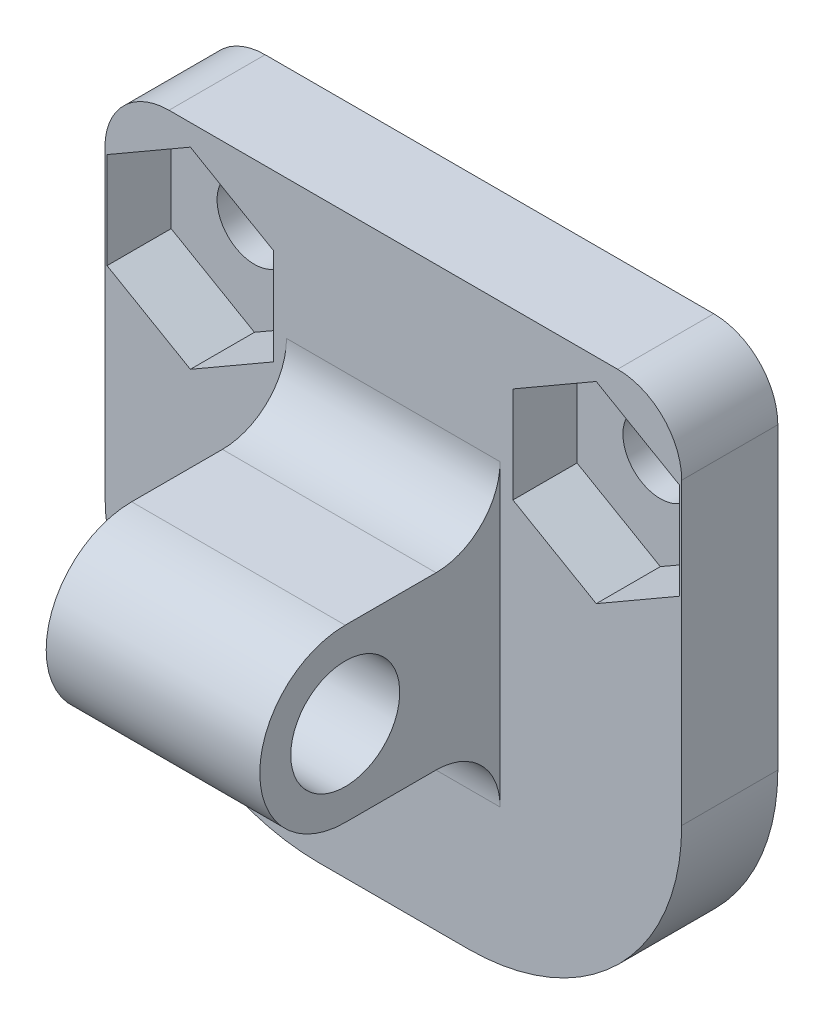
ISO-10303-21;
HEADER;
FILE_DESCRIPTION(('STEP AP214'),'2;1');
FILE_NAME('part.step','',(''),(''),'','','');
FILE_SCHEMA(('AUTOMOTIVE_DESIGN { 1 0 10303 214 1 1 1 1 }'));
ENDSEC;
DATA;
#1=APPLICATION_CONTEXT('core data for automotive mechanical design processes');
#2=APPLICATION_PROTOCOL_DEFINITION('international standard','automotive_design',2000,#1);
#3=PRODUCT_CONTEXT('',#1,'mechanical');
#4=PRODUCT('Part','Part','',(#3));
#5=PRODUCT_RELATED_PRODUCT_CATEGORY('part','',(#4));
#6=PRODUCT_DEFINITION_FORMATION('','',#4);
#7=PRODUCT_DEFINITION_CONTEXT('part definition',#1,'design');
#8=PRODUCT_DEFINITION('design','',#6,#7);
#9=PRODUCT_DEFINITION_SHAPE('','',#8);
#10=(LENGTH_UNIT() NAMED_UNIT(*) SI_UNIT(.MILLI.,.METRE.));
#11=(NAMED_UNIT(*) PLANE_ANGLE_UNIT() SI_UNIT($,.RADIAN.));
#12=(NAMED_UNIT(*) SI_UNIT($,.STERADIAN.) SOLID_ANGLE_UNIT());
#13=UNCERTAINTY_MEASURE_WITH_UNIT(LENGTH_MEASURE(1.E-05),#10,'distance_accuracy_value','');
#14=(GEOMETRIC_REPRESENTATION_CONTEXT(3) GLOBAL_UNCERTAINTY_ASSIGNED_CONTEXT((#13)) GLOBAL_UNIT_ASSIGNED_CONTEXT((#10,
#11,#12)) REPRESENTATION_CONTEXT('',''));
#15=CARTESIAN_POINT('',(0.,0.,0.));
#16=DIRECTION('',(0.,0.,1.));
#17=DIRECTION('',(1.,0.,0.));
#18=AXIS2_PLACEMENT_3D('',#15,#16,#17);
#19=CARTESIAN_POINT('',(-9.5,8.,4.5));
#20=DIRECTION('',(0.,0.,-1.));
#21=DIRECTION('',(-1.,0.,0.));
#22=AXIS2_PLACEMENT_3D('',#19,#20,#21);
#23=CYLINDRICAL_SURFACE('',#22,1.75);
#24=CARTESIAN_POINT('',(-9.5,8.,0.));
#25=DIRECTION('',(0.,0.,1.));
#26=DIRECTION('',(1.,0.,0.));
#27=AXIS2_PLACEMENT_3D('',#24,#25,#26);
#28=CIRCLE('',#27,1.75);
#29=CARTESIAN_POINT('',(-7.75,8.,0.));
#30=VERTEX_POINT('',#29);
#31=EDGE_CURVE('E426',#30,#30,#28,.T.);
#32=ORIENTED_EDGE('',*,*,#31,.F.);
#33=EDGE_LOOP('',(#32));
#34=FACE_BOUND('',#33,.T.);
#35=CARTESIAN_POINT('',(-9.5,8.,1.5));
#36=DIRECTION('',(0.,0.,1.));
#37=DIRECTION('',(1.,0.,0.));
#38=AXIS2_PLACEMENT_3D('',#35,#36,#37);
#39=CIRCLE('',#38,1.75);
#40=CARTESIAN_POINT('',(-7.75,8.,1.5));
#41=VERTEX_POINT('',#40);
#42=EDGE_CURVE('E369',#41,#41,#39,.T.);
#43=ORIENTED_EDGE('',*,*,#42,.T.);
#44=EDGE_LOOP('',(#43));
#45=FACE_BOUND('',#44,.T.);
#46=ADVANCED_FACE('F43',(#34,#45),#23,.F.);
#47=CARTESIAN_POINT('',(-5.,0.,11.75));
#48=DIRECTION('',(1.,0.,0.));
#49=DIRECTION('',(0.,0.,-1.));
#50=AXIS2_PLACEMENT_3D('',#47,#48,#49);
#51=CYLINDRICAL_SURFACE('',#50,4.);
#52=DIRECTION('',(1.,0.,0.));
#53=VECTOR('',#52,1.);
#54=CARTESIAN_POINT('',(0.,4.,11.75));
#55=LINE('',#54,#53);
#56=CARTESIAN_POINT('',(-5.,4.,11.75));
#57=VERTEX_POINT('',#56);
#58=CARTESIAN_POINT('',(5.,4.,11.75));
#59=VERTEX_POINT('',#58);
#60=EDGE_CURVE('E458',#57,#59,#55,.T.);
#61=ORIENTED_EDGE('',*,*,#60,.F.);
#62=CARTESIAN_POINT('',(-5.,0.,11.75));
#63=DIRECTION('',(-1.,0.,0.));
#64=DIRECTION('',(0.,0.,1.));
#65=AXIS2_PLACEMENT_3D('',#62,#63,#64);
#66=CIRCLE('',#65,4.);
#67=CARTESIAN_POINT('',(-5.,-4.,11.75));
#68=VERTEX_POINT('',#67);
#69=EDGE_CURVE('E466',#68,#57,#66,.T.);
#70=ORIENTED_EDGE('',*,*,#69,.F.);
#71=DIRECTION('',(-1.,0.,0.));
#72=VECTOR('',#71,1.);
#73=CARTESIAN_POINT('',(-5.,-4.,11.75));
#74=LINE('',#73,#72);
#75=CARTESIAN_POINT('',(5.,-4.,11.75));
#76=VERTEX_POINT('',#75);
#77=EDGE_CURVE('E462',#76,#68,#74,.T.);
#78=ORIENTED_EDGE('',*,*,#77,.F.);
#79=CARTESIAN_POINT('',(5.,0.,11.75));
#80=DIRECTION('',(-1.,0.,0.));
#81=DIRECTION('',(0.,0.,1.));
#82=AXIS2_PLACEMENT_3D('',#79,#80,#81);
#83=CIRCLE('',#82,4.);
#84=EDGE_CURVE('E469',#59,#76,#83,.F.);
#85=ORIENTED_EDGE('',*,*,#84,.F.);
#86=EDGE_LOOP('',(#61,#70,#78,#85));
#87=FACE_BOUND('',#86,.T.);
#88=ADVANCED_FACE('F562',(#87),#51,.T.);
#89=CARTESIAN_POINT('',(0.,0.,4.5));
#90=DIRECTION('',(0.,0.,1.));
#91=DIRECTION('',(1.,0.,0.));
#92=AXIS2_PLACEMENT_3D('',#89,#90,#91);
#93=PLANE('',#92);
#94=DIRECTION('',(-0.866025403784439,0.5,0.));
#95=VECTOR('',#94,1.);
#96=CARTESIAN_POINT('',(-5.59999999999999,10.2516660498396,4.5));
#97=LINE('',#96,#95);
#98=CARTESIAN_POINT('',(-5.59999999999999,10.2516660498396,4.5));
#99=VERTEX_POINT('',#98);
#100=CARTESIAN_POINT('',(-9.49999999999998,12.5033320996791,4.5));
#101=VERTEX_POINT('',#100);
#102=EDGE_CURVE('E228',#99,#101,#97,.T.);
#103=ORIENTED_EDGE('',*,*,#102,.F.);
#104=DIRECTION('',(0.,1.,0.));
#105=VECTOR('',#104,1.);
#106=CARTESIAN_POINT('',(-5.59999999999999,5.74833395016049,4.5));
#107=LINE('',#106,#105);
#108=CARTESIAN_POINT('',(-5.59999999999999,5.74833395016049,4.5));
#109=VERTEX_POINT('',#108);
#110=EDGE_CURVE('E249',#109,#99,#107,.T.);
#111=ORIENTED_EDGE('',*,*,#110,.F.);
#112=DIRECTION('',(0.866025403784439,0.5,0.));
#113=VECTOR('',#112,1.);
#114=CARTESIAN_POINT('',(-9.49999999999998,3.49666790032095,4.5));
#115=LINE('',#114,#113);
#116=CARTESIAN_POINT('',(-9.49999999999998,3.49666790032095,4.5));
#117=VERTEX_POINT('',#116);
#118=EDGE_CURVE('E253',#117,#109,#115,.T.);
#119=ORIENTED_EDGE('',*,*,#118,.F.);
#120=DIRECTION('',(0.866025403784439,-0.5,0.));
#121=VECTOR('',#120,1.);
#122=CARTESIAN_POINT('',(-13.4,5.74833395016049,4.5));
#123=LINE('',#122,#121);
#124=CARTESIAN_POINT('',(-13.4,5.74833395016049,4.5));
#125=VERTEX_POINT('',#124);
#126=EDGE_CURVE('E277',#125,#117,#123,.T.);
#127=ORIENTED_EDGE('',*,*,#126,.F.);
#128=DIRECTION('',(0.,-1.,0.));
#129=VECTOR('',#128,1.);
#130=CARTESIAN_POINT('',(-13.4,10.2516660498396,4.5));
#131=LINE('',#130,#129);
#132=CARTESIAN_POINT('',(-13.4,10.2516660498396,4.5));
#133=VERTEX_POINT('',#132);
#134=EDGE_CURVE('E273',#133,#125,#131,.T.);
#135=ORIENTED_EDGE('',*,*,#134,.F.);
#136=DIRECTION('',(-0.866025403784439,-0.5,0.));
#137=VECTOR('',#136,1.);
#138=CARTESIAN_POINT('',(-9.49999999999998,12.5033320996791,4.5));
#139=LINE('',#138,#137);
#140=EDGE_CURVE('E269',#101,#133,#139,.T.);
#141=ORIENTED_EDGE('',*,*,#140,.F.);
#142=EDGE_LOOP('',(#103,#111,#119,#127,#135,#141));
#143=FACE_BOUND('',#142,.T.);
#144=DIRECTION('',(0.,-1.,0.));
#145=VECTOR('',#144,1.);
#146=CARTESIAN_POINT('',(5.59999999999999,5.74833395016049,4.5));
#147=LINE('',#146,#145);
#148=CARTESIAN_POINT('',(5.59999999999999,10.2516660498396,4.5));
#149=VERTEX_POINT('',#148);
#150=CARTESIAN_POINT('',(5.59999999999999,5.74833395016049,4.5));
#151=VERTEX_POINT('',#150);
#152=EDGE_CURVE('E325',#149,#151,#147,.T.);
#153=ORIENTED_EDGE('',*,*,#152,.F.);
#154=DIRECTION('',(-0.866025403784439,-0.5,0.));
#155=VECTOR('',#154,1.);
#156=CARTESIAN_POINT('',(5.59999999999999,10.2516660498396,4.5));
#157=LINE('',#156,#155);
#158=CARTESIAN_POINT('',(9.49999999999998,12.5033320996791,4.5));
#159=VERTEX_POINT('',#158);
#160=EDGE_CURVE('E304',#159,#149,#157,.T.);
#161=ORIENTED_EDGE('',*,*,#160,.F.);
#162=DIRECTION('',(-0.866025403784439,0.5,0.));
#163=VECTOR('',#162,1.);
#164=CARTESIAN_POINT('',(9.49999999999998,12.5033320996791,4.5));
#165=LINE('',#164,#163);
#166=CARTESIAN_POINT('',(13.4,10.2516660498396,4.5));
#167=VERTEX_POINT('',#166);
#168=EDGE_CURVE('E340',#167,#159,#165,.T.);
#169=ORIENTED_EDGE('',*,*,#168,.F.);
#170=DIRECTION('',(0.,1.,0.));
#171=VECTOR('',#170,1.);
#172=CARTESIAN_POINT('',(13.4,10.2516660498396,4.5));
#173=LINE('',#172,#171);
#174=CARTESIAN_POINT('',(13.4,5.74833395016049,4.5));
#175=VERTEX_POINT('',#174);
#176=EDGE_CURVE('E336',#175,#167,#173,.T.);
#177=ORIENTED_EDGE('',*,*,#176,.F.);
#178=DIRECTION('',(0.866025403784439,0.5,0.));
#179=VECTOR('',#178,1.);
#180=CARTESIAN_POINT('',(13.4,5.74833395016049,4.5));
#181=LINE('',#180,#179);
#182=CARTESIAN_POINT('',(9.49999999999998,3.49666790032095,4.5));
#183=VERTEX_POINT('',#182);
#184=EDGE_CURVE('E332',#183,#175,#181,.T.);
#185=ORIENTED_EDGE('',*,*,#184,.F.);
#186=DIRECTION('',(0.866025403784439,-0.5,0.));
#187=VECTOR('',#186,1.);
#188=CARTESIAN_POINT('',(9.49999999999998,3.49666790032095,4.5));
#189=LINE('',#188,#187);
#190=EDGE_CURVE('E328',#151,#183,#189,.T.);
#191=ORIENTED_EDGE('',*,*,#190,.F.);
#192=EDGE_LOOP('',(#153,#161,#169,#177,#185,#191));
#193=FACE_BOUND('',#192,.T.);
#194=DIRECTION('',(0.,1.,0.));
#195=VECTOR('',#194,1.);
#196=CARTESIAN_POINT('',(13.5,0.,4.5));
#197=LINE('',#196,#195);
#198=CARTESIAN_POINT('',(13.5,-3.5,4.5));
#199=VERTEX_POINT('',#198);
#200=CARTESIAN_POINT('',(13.5,10.5,4.5));
#201=VERTEX_POINT('',#200);
#202=EDGE_CURVE('E400',#199,#201,#197,.T.);
#203=ORIENTED_EDGE('',*,*,#202,.T.);
#204=CARTESIAN_POINT('',(10.5,10.5,4.5));
#205=DIRECTION('',(0.,0.,1.));
#206=DIRECTION('',(1.,0.,0.));
#207=AXIS2_PLACEMENT_3D('',#204,#205,#206);
#208=CIRCLE('',#207,3.);
#209=CARTESIAN_POINT('',(10.5,13.5,4.5));
#210=VERTEX_POINT('',#209);
#211=EDGE_CURVE('E52',#201,#210,#208,.T.);
#212=ORIENTED_EDGE('',*,*,#211,.T.);
#213=DIRECTION('',(1.,0.,0.));
#214=VECTOR('',#213,1.);
#215=CARTESIAN_POINT('',(0.,13.5,4.5));
#216=LINE('',#215,#214);
#217=CARTESIAN_POINT('',(-10.5,13.5,4.5));
#218=VERTEX_POINT('',#217);
#219=EDGE_CURVE('E404',#218,#210,#216,.T.);
#220=ORIENTED_EDGE('',*,*,#219,.F.);
#221=CARTESIAN_POINT('',(-10.5,10.5,4.5));
#222=DIRECTION('',(0.,0.,1.));
#223=DIRECTION('',(1.,0.,0.));
#224=AXIS2_PLACEMENT_3D('',#221,#222,#223);
#225=CIRCLE('',#224,3.);
#226=CARTESIAN_POINT('',(-13.5,10.5,4.5));
#227=VERTEX_POINT('',#226);
#228=EDGE_CURVE('E59',#218,#227,#225,.T.);
#229=ORIENTED_EDGE('',*,*,#228,.T.);
#230=DIRECTION('',(0.,1.,0.));
#231=VECTOR('',#230,1.);
#232=CARTESIAN_POINT('',(-13.5,0.,4.5));
#233=LINE('',#232,#231);
#234=CARTESIAN_POINT('',(-13.5,-3.5,4.5));
#235=VERTEX_POINT('',#234);
#236=EDGE_CURVE('E408',#235,#227,#233,.T.);
#237=ORIENTED_EDGE('',*,*,#236,.F.);
#238=CARTESIAN_POINT('',(-3.5,-3.5,4.5));
#239=DIRECTION('',(0.,0.,1.));
#240=DIRECTION('',(1.,0.,0.));
#241=AXIS2_PLACEMENT_3D('',#238,#239,#240);
#242=CIRCLE('',#241,10.);
#243=CARTESIAN_POINT('',(-3.5,-13.5,4.5));
#244=VERTEX_POINT('',#243);
#245=EDGE_CURVE('E449',#235,#244,#242,.T.);
#246=ORIENTED_EDGE('',*,*,#245,.T.);
#247=DIRECTION('',(1.,0.,0.));
#248=VECTOR('',#247,1.);
#249=CARTESIAN_POINT('',(0.,-13.5,4.5));
#250=LINE('',#249,#248);
#251=CARTESIAN_POINT('',(3.5,-13.5,4.5));
#252=VERTEX_POINT('',#251);
#253=EDGE_CURVE('E396',#244,#252,#250,.T.);
#254=ORIENTED_EDGE('',*,*,#253,.T.);
#255=CARTESIAN_POINT('',(3.5,-3.5,4.5));
#256=DIRECTION('',(0.,0.,1.));
#257=DIRECTION('',(1.,0.,0.));
#258=AXIS2_PLACEMENT_3D('',#255,#256,#257);
#259=CIRCLE('',#258,10.);
#260=EDGE_CURVE('E452',#252,#199,#259,.T.);
#261=ORIENTED_EDGE('',*,*,#260,.T.);
#262=EDGE_LOOP('',(#203,#212,#220,#229,#237,#246,#254,#261));
#263=FACE_BOUND('',#262,.T.);
#264=DIRECTION('',(-1.,0.,0.));
#265=VECTOR('',#264,1.);
#266=CARTESIAN_POINT('',(0.,-7.,4.5));
#267=LINE('',#266,#265);
#268=CARTESIAN_POINT('',(5.,-7.,4.5));
#269=VERTEX_POINT('',#268);
#270=CARTESIAN_POINT('',(-5.,-7.,4.5));
#271=VERTEX_POINT('',#270);
#272=EDGE_CURVE('E476',#269,#271,#267,.T.);
#273=ORIENTED_EDGE('',*,*,#272,.T.);
#274=DIRECTION('',(0.,-1.,0.));
#275=VECTOR('',#274,1.);
#276=CARTESIAN_POINT('',(-5.,0.,4.5));
#277=LINE('',#276,#275);
#278=CARTESIAN_POINT('',(-5.,7.,4.5));
#279=VERTEX_POINT('',#278);
#280=EDGE_CURVE('E389',#279,#271,#277,.T.);
#281=ORIENTED_EDGE('',*,*,#280,.F.);
#282=DIRECTION('',(-1.,0.,0.));
#283=VECTOR('',#282,1.);
#284=CARTESIAN_POINT('',(5.,7.,4.5));
#285=LINE('',#284,#283);
#286=CARTESIAN_POINT('',(5.,7.,4.5));
#287=VERTEX_POINT('',#286);
#288=EDGE_CURVE('E472',#279,#287,#285,.F.);
#289=ORIENTED_EDGE('',*,*,#288,.T.);
#290=DIRECTION('',(0.,-1.,0.));
#291=VECTOR('',#290,1.);
#292=CARTESIAN_POINT('',(5.,0.,4.5));
#293=LINE('',#292,#291);
#294=EDGE_CURVE('E392',#287,#269,#293,.T.);
#295=ORIENTED_EDGE('',*,*,#294,.T.);
#296=EDGE_LOOP('',(#273,#281,#289,#295));
#297=FACE_BOUND('',#296,.T.);
#298=ADVANCED_FACE('F525',(#143,#193,#263,#297),#93,.T.);
#299=CARTESIAN_POINT('',(0.,-13.5,4.5));
#300=DIRECTION('',(0.,1.,0.));
#301=DIRECTION('',(0.,0.,1.));
#302=AXIS2_PLACEMENT_3D('',#299,#300,#301);
#303=PLANE('',#302);
#304=DIRECTION('',(1.,0.,0.));
#305=VECTOR('',#304,1.);
#306=CARTESIAN_POINT('',(0.,-13.5,0.));
#307=LINE('',#306,#305);
#308=CARTESIAN_POINT('',(-3.5,-13.5,0.));
#309=VERTEX_POINT('',#308);
#310=CARTESIAN_POINT('',(3.5,-13.5,0.));
#311=VERTEX_POINT('',#310);
#312=EDGE_CURVE('E395',#309,#311,#307,.T.);
#313=ORIENTED_EDGE('',*,*,#312,.T.);
#314=DIRECTION('',(0.,0.,-1.));
#315=VECTOR('',#314,1.);
#316=CARTESIAN_POINT('',(3.5,-13.5,4.5));
#317=LINE('',#316,#315);
#318=EDGE_CURVE('E446',#311,#252,#317,.F.);
#319=ORIENTED_EDGE('',*,*,#318,.T.);
#320=ORIENTED_EDGE('',*,*,#253,.F.);
#321=DIRECTION('',(0.,0.,-1.));
#322=VECTOR('',#321,1.);
#323=CARTESIAN_POINT('',(-3.5,-13.5,0.));
#324=LINE('',#323,#322);
#325=EDGE_CURVE('E442',#244,#309,#324,.T.);
#326=ORIENTED_EDGE('',*,*,#325,.T.);
#327=EDGE_LOOP('',(#313,#319,#320,#326));
#328=FACE_BOUND('',#327,.T.);
#329=ADVANCED_FACE('F545',(#328),#303,.F.);
#330=CARTESIAN_POINT('',(13.5,0.,4.5));
#331=DIRECTION('',(-1.,0.,0.));
#332=DIRECTION('',(0.,0.,1.));
#333=AXIS2_PLACEMENT_3D('',#330,#331,#332);
#334=PLANE('',#333);
#335=DIRECTION('',(0.,1.,0.));
#336=VECTOR('',#335,1.);
#337=CARTESIAN_POINT('',(13.5,0.,0.));
#338=LINE('',#337,#336);
#339=CARTESIAN_POINT('',(13.5,-3.5,0.));
#340=VERTEX_POINT('',#339);
#341=CARTESIAN_POINT('',(13.5,10.5,0.));
#342=VERTEX_POINT('',#341);
#343=EDGE_CURVE('E415',#340,#342,#338,.T.);
#344=ORIENTED_EDGE('',*,*,#343,.T.);
#345=DIRECTION('',(0.,0.,-1.));
#346=VECTOR('',#345,1.);
#347=CARTESIAN_POINT('',(13.5,10.5,4.5));
#348=LINE('',#347,#346);
#349=EDGE_CURVE('E67',#342,#201,#348,.F.);
#350=ORIENTED_EDGE('',*,*,#349,.T.);
#351=ORIENTED_EDGE('',*,*,#202,.F.);
#352=DIRECTION('',(0.,0.,-1.));
#353=VECTOR('',#352,1.);
#354=CARTESIAN_POINT('',(13.5,-3.5,4.5));
#355=LINE('',#354,#353);
#356=EDGE_CURVE('E411',#199,#340,#355,.T.);
#357=ORIENTED_EDGE('',*,*,#356,.T.);
#358=EDGE_LOOP('',(#344,#350,#351,#357));
#359=FACE_BOUND('',#358,.T.);
#360=ADVANCED_FACE('F537',(#359),#334,.F.);
#361=CARTESIAN_POINT('',(0.,13.5,4.5));
#362=DIRECTION('',(0.,1.,0.));
#363=DIRECTION('',(0.,0.,1.));
#364=AXIS2_PLACEMENT_3D('',#361,#362,#363);
#365=PLANE('',#364);
#366=ORIENTED_EDGE('',*,*,#219,.T.);
#367=DIRECTION('',(0.,0.,-1.));
#368=VECTOR('',#367,1.);
#369=CARTESIAN_POINT('',(10.5,13.5,0.));
#370=LINE('',#369,#368);
#371=CARTESIAN_POINT('',(10.5,13.5,0.));
#372=VERTEX_POINT('',#371);
#373=EDGE_CURVE('E510',#210,#372,#370,.T.);
#374=ORIENTED_EDGE('',*,*,#373,.T.);
#375=DIRECTION('',(1.,0.,0.));
#376=VECTOR('',#375,1.);
#377=CARTESIAN_POINT('',(0.,13.5,0.));
#378=LINE('',#377,#376);
#379=CARTESIAN_POINT('',(-10.5,13.5,0.));
#380=VERTEX_POINT('',#379);
#381=EDGE_CURVE('E418',#380,#372,#378,.T.);
#382=ORIENTED_EDGE('',*,*,#381,.F.);
#383=DIRECTION('',(0.,0.,-1.));
#384=VECTOR('',#383,1.);
#385=CARTESIAN_POINT('',(-10.5,13.5,4.5));
#386=LINE('',#385,#384);
#387=EDGE_CURVE('E501',#380,#218,#386,.F.);
#388=ORIENTED_EDGE('',*,*,#387,.T.);
#389=EDGE_LOOP('',(#366,#374,#382,#388));
#390=FACE_BOUND('',#389,.T.);
#391=ADVANCED_FACE('F530',(#390),#365,.T.);
#392=CARTESIAN_POINT('',(-13.5,0.,4.5));
#393=DIRECTION('',(-1.,0.,0.));
#394=DIRECTION('',(0.,0.,1.));
#395=AXIS2_PLACEMENT_3D('',#392,#393,#394);
#396=PLANE('',#395);
#397=ORIENTED_EDGE('',*,*,#236,.T.);
#398=DIRECTION('',(0.,0.,-1.));
#399=VECTOR('',#398,1.);
#400=CARTESIAN_POINT('',(-13.5,10.5,4.5));
#401=LINE('',#400,#399);
#402=CARTESIAN_POINT('',(-13.5,10.5,0.));
#403=VERTEX_POINT('',#402);
#404=EDGE_CURVE('E11',#227,#403,#401,.T.);
#405=ORIENTED_EDGE('',*,*,#404,.T.);
#406=DIRECTION('',(0.,1.,0.));
#407=VECTOR('',#406,1.);
#408=CARTESIAN_POINT('',(-13.5,0.,0.));
#409=LINE('',#408,#407);
#410=CARTESIAN_POINT('',(-13.5,-3.5,0.));
#411=VERTEX_POINT('',#410);
#412=EDGE_CURVE('E422',#411,#403,#409,.T.);
#413=ORIENTED_EDGE('',*,*,#412,.F.);
#414=DIRECTION('',(0.,0.,-1.));
#415=VECTOR('',#414,1.);
#416=CARTESIAN_POINT('',(-13.5,-3.5,4.5));
#417=LINE('',#416,#415);
#418=EDGE_CURVE('E455',#411,#235,#417,.F.);
#419=ORIENTED_EDGE('',*,*,#418,.T.);
#420=EDGE_LOOP('',(#397,#405,#413,#419));
#421=FACE_BOUND('',#420,.T.);
#422=ADVANCED_FACE('F554',(#421),#396,.T.);
#423=CARTESIAN_POINT('',(9.5,8.,4.5));
#424=DIRECTION('',(0.,0.,-1.));
#425=DIRECTION('',(-1.,0.,0.));
#426=AXIS2_PLACEMENT_3D('',#423,#424,#425);
#427=CYLINDRICAL_SURFACE('',#426,1.75);
#428=CARTESIAN_POINT('',(9.5,8.,1.5));
#429=DIRECTION('',(0.,0.,-1.));
#430=DIRECTION('',(-1.,0.,0.));
#431=AXIS2_PLACEMENT_3D('',#428,#429,#430);
#432=CIRCLE('',#431,1.75);
#433=CARTESIAN_POINT('',(7.75,8.,1.5));
#434=VERTEX_POINT('',#433);
#435=EDGE_CURVE('E287',#434,#434,#432,.F.);
#436=ORIENTED_EDGE('',*,*,#435,.T.);
#437=EDGE_LOOP('',(#436));
#438=FACE_BOUND('',#437,.T.);
#439=CARTESIAN_POINT('',(9.5,8.,0.));
#440=DIRECTION('',(0.,0.,1.));
#441=DIRECTION('',(1.,0.,0.));
#442=AXIS2_PLACEMENT_3D('',#439,#440,#441);
#443=CIRCLE('',#442,1.75);
#444=CARTESIAN_POINT('',(11.25,8.,0.));
#445=VERTEX_POINT('',#444);
#446=EDGE_CURVE('E401',#445,#445,#443,.F.);
#447=ORIENTED_EDGE('',*,*,#446,.T.);
#448=EDGE_LOOP('',(#447));
#449=FACE_BOUND('',#448,.T.);
#450=ADVANCED_FACE('F574',(#438,#449),#427,.F.);
#451=CARTESIAN_POINT('',(0.,0.,0.));
#452=DIRECTION('',(0.,0.,1.));
#453=DIRECTION('',(1.,0.,0.));
#454=AXIS2_PLACEMENT_3D('',#451,#452,#453);
#455=PLANE('',#454);
#456=ORIENTED_EDGE('',*,*,#446,.F.);
#457=EDGE_LOOP('',(#456));
#458=FACE_BOUND('',#457,.T.);
#459=ORIENTED_EDGE('',*,*,#31,.T.);
#460=EDGE_LOOP('',(#459));
#461=FACE_BOUND('',#460,.T.);
#462=ORIENTED_EDGE('',*,*,#381,.T.);
#463=CARTESIAN_POINT('',(10.5,10.5,0.));
#464=DIRECTION('',(0.,0.,1.));
#465=DIRECTION('',(1.,0.,0.));
#466=AXIS2_PLACEMENT_3D('',#463,#464,#465);
#467=CIRCLE('',#466,3.);
#468=EDGE_CURVE('E517',#372,#342,#467,.F.);
#469=ORIENTED_EDGE('',*,*,#468,.T.);
#470=ORIENTED_EDGE('',*,*,#343,.F.);
#471=CARTESIAN_POINT('',(3.5,-3.5,0.));
#472=DIRECTION('',(0.,0.,1.));
#473=DIRECTION('',(1.,0.,0.));
#474=AXIS2_PLACEMENT_3D('',#471,#472,#473);
#475=CIRCLE('',#474,10.);
#476=EDGE_CURVE('E439',#340,#311,#475,.F.);
#477=ORIENTED_EDGE('',*,*,#476,.T.);
#478=ORIENTED_EDGE('',*,*,#312,.F.);
#479=CARTESIAN_POINT('',(-3.5,-3.5,0.));
#480=DIRECTION('',(0.,0.,1.));
#481=DIRECTION('',(1.,0.,0.));
#482=AXIS2_PLACEMENT_3D('',#479,#480,#481);
#483=CIRCLE('',#482,10.);
#484=EDGE_CURVE('E436',#309,#411,#483,.F.);
#485=ORIENTED_EDGE('',*,*,#484,.T.);
#486=ORIENTED_EDGE('',*,*,#412,.T.);
#487=CARTESIAN_POINT('',(-10.5,10.5,0.));
#488=DIRECTION('',(0.,0.,1.));
#489=DIRECTION('',(1.,0.,0.));
#490=AXIS2_PLACEMENT_3D('',#487,#488,#489);
#491=CIRCLE('',#490,3.);
#492=EDGE_CURVE('E514',#403,#380,#491,.F.);
#493=ORIENTED_EDGE('',*,*,#492,.T.);
#494=EDGE_LOOP('',(#462,#469,#470,#477,#478,#485,#486,#493));
#495=FACE_BOUND('',#494,.T.);
#496=ADVANCED_FACE('F536',(#458,#461,#495),#455,.F.);
#497=CARTESIAN_POINT('',(0.,-4.,15.75));
#498=DIRECTION('',(0.,1.,0.));
#499=DIRECTION('',(0.,0.,1.));
#500=AXIS2_PLACEMENT_3D('',#497,#498,#499);
#501=PLANE('',#500);
#502=DIRECTION('',(0.,0.,-1.));
#503=VECTOR('',#502,1.);
#504=CARTESIAN_POINT('',(-5.,-4.,15.75));
#505=LINE('',#504,#503);
#506=CARTESIAN_POINT('',(-5.,-4.,7.5));
#507=VERTEX_POINT('',#506);
#508=EDGE_CURVE('E373',#68,#507,#505,.T.);
#509=ORIENTED_EDGE('',*,*,#508,.T.);
#510=DIRECTION('',(-1.,0.,0.));
#511=VECTOR('',#510,1.);
#512=CARTESIAN_POINT('',(0.,-4.,7.5));
#513=LINE('',#512,#511);
#514=CARTESIAN_POINT('',(5.,-4.,7.5));
#515=VERTEX_POINT('',#514);
#516=EDGE_CURVE('E480',#507,#515,#513,.F.);
#517=ORIENTED_EDGE('',*,*,#516,.T.);
#518=DIRECTION('',(0.,0.,-1.));
#519=VECTOR('',#518,1.);
#520=CARTESIAN_POINT('',(5.,-4.,15.75));
#521=LINE('',#520,#519);
#522=EDGE_CURVE('E385',#76,#515,#521,.T.);
#523=ORIENTED_EDGE('',*,*,#522,.F.);
#524=ORIENTED_EDGE('',*,*,#77,.T.);
#525=EDGE_LOOP('',(#509,#517,#523,#524));
#526=FACE_BOUND('',#525,.T.);
#527=ADVANCED_FACE('F626',(#526),#501,.F.);
#528=CARTESIAN_POINT('',(5.,0.,15.75));
#529=DIRECTION('',(-1.,0.,0.));
#530=DIRECTION('',(0.,0.,1.));
#531=AXIS2_PLACEMENT_3D('',#528,#529,#530);
#532=PLANE('',#531);
#533=CARTESIAN_POINT('',(5.,0.,11.75));
#534=DIRECTION('',(-1.,0.,0.));
#535=DIRECTION('',(0.,0.,1.));
#536=AXIS2_PLACEMENT_3D('',#533,#534,#535);
#537=CIRCLE('',#536,2.55);
#538=CARTESIAN_POINT('',(5.,0.,14.3));
#539=VERTEX_POINT('',#538);
#540=EDGE_CURVE('E368',#539,#539,#537,.T.);
#541=ORIENTED_EDGE('',*,*,#540,.T.);
#542=EDGE_LOOP('',(#541));
#543=FACE_BOUND('',#542,.T.);
#544=DIRECTION('',(0.,0.,-1.));
#545=VECTOR('',#544,1.);
#546=CARTESIAN_POINT('',(5.,4.,15.75));
#547=LINE('',#546,#545);
#548=CARTESIAN_POINT('',(5.,4.,7.5));
#549=VERTEX_POINT('',#548);
#550=EDGE_CURVE('E381',#59,#549,#547,.T.);
#551=ORIENTED_EDGE('',*,*,#550,.F.);
#552=ORIENTED_EDGE('',*,*,#84,.T.);
#553=ORIENTED_EDGE('',*,*,#522,.T.);
#554=CARTESIAN_POINT('',(5.,-7.,7.5));
#555=DIRECTION('',(-1.,0.,0.));
#556=DIRECTION('',(0.,0.,1.));
#557=AXIS2_PLACEMENT_3D('',#554,#555,#556);
#558=CIRCLE('',#557,3.);
#559=EDGE_CURVE('E490',#515,#269,#558,.T.);
#560=ORIENTED_EDGE('',*,*,#559,.T.);
#561=ORIENTED_EDGE('',*,*,#294,.F.);
#562=CARTESIAN_POINT('',(5.,7.,7.5));
#563=DIRECTION('',(-1.,0.,0.));
#564=DIRECTION('',(0.,0.,1.));
#565=AXIS2_PLACEMENT_3D('',#562,#563,#564);
#566=CIRCLE('',#565,3.);
#567=EDGE_CURVE('E498',#287,#549,#566,.T.);
#568=ORIENTED_EDGE('',*,*,#567,.T.);
#569=EDGE_LOOP('',(#551,#552,#553,#560,#561,#568));
#570=FACE_BOUND('',#569,.T.);
#571=ADVANCED_FACE('F612',(#543,#570),#532,.F.);
#572=CARTESIAN_POINT('',(0.,4.,15.75));
#573=DIRECTION('',(0.,1.,0.));
#574=DIRECTION('',(0.,0.,1.));
#575=AXIS2_PLACEMENT_3D('',#572,#573,#574);
#576=PLANE('',#575);
#577=ORIENTED_EDGE('',*,*,#550,.T.);
#578=DIRECTION('',(-1.,0.,0.));
#579=VECTOR('',#578,1.);
#580=CARTESIAN_POINT('',(-5.,4.,7.5));
#581=LINE('',#580,#579);
#582=CARTESIAN_POINT('',(-5.,4.,7.5));
#583=VERTEX_POINT('',#582);
#584=EDGE_CURVE('E483',#549,#583,#581,.T.);
#585=ORIENTED_EDGE('',*,*,#584,.T.);
#586=DIRECTION('',(0.,0.,-1.));
#587=VECTOR('',#586,1.);
#588=CARTESIAN_POINT('',(-5.,4.,15.75));
#589=LINE('',#588,#587);
#590=EDGE_CURVE('E377',#57,#583,#589,.T.);
#591=ORIENTED_EDGE('',*,*,#590,.F.);
#592=ORIENTED_EDGE('',*,*,#60,.T.);
#593=EDGE_LOOP('',(#577,#585,#591,#592));
#594=FACE_BOUND('',#593,.T.);
#595=ADVANCED_FACE('F614',(#594),#576,.T.);
#596=CARTESIAN_POINT('',(-5.,0.,15.75));
#597=DIRECTION('',(-1.,0.,0.));
#598=DIRECTION('',(0.,0.,1.));
#599=AXIS2_PLACEMENT_3D('',#596,#597,#598);
#600=PLANE('',#599);
#601=CARTESIAN_POINT('',(-5.,0.,11.75));
#602=DIRECTION('',(-1.,0.,0.));
#603=DIRECTION('',(0.,0.,1.));
#604=AXIS2_PLACEMENT_3D('',#601,#602,#603);
#605=CIRCLE('',#604,2.55);
#606=CARTESIAN_POINT('',(-5.,0.,14.3));
#607=VERTEX_POINT('',#606);
#608=EDGE_CURVE('E364',#607,#607,#605,.T.);
#609=ORIENTED_EDGE('',*,*,#608,.F.);
#610=EDGE_LOOP('',(#609));
#611=FACE_BOUND('',#610,.T.);
#612=ORIENTED_EDGE('',*,*,#508,.F.);
#613=ORIENTED_EDGE('',*,*,#69,.T.);
#614=ORIENTED_EDGE('',*,*,#590,.T.);
#615=CARTESIAN_POINT('',(-5.,7.,7.5));
#616=DIRECTION('',(-1.,0.,0.));
#617=DIRECTION('',(0.,0.,1.));
#618=AXIS2_PLACEMENT_3D('',#615,#616,#617);
#619=CIRCLE('',#618,3.);
#620=EDGE_CURVE('E494',#583,#279,#619,.F.);
#621=ORIENTED_EDGE('',*,*,#620,.T.);
#622=ORIENTED_EDGE('',*,*,#280,.T.);
#623=CARTESIAN_POINT('',(-5.,-7.,7.5));
#624=DIRECTION('',(-1.,0.,0.));
#625=DIRECTION('',(0.,0.,1.));
#626=AXIS2_PLACEMENT_3D('',#623,#624,#625);
#627=CIRCLE('',#626,3.);
#628=EDGE_CURVE('E487',#271,#507,#627,.F.);
#629=ORIENTED_EDGE('',*,*,#628,.T.);
#630=EDGE_LOOP('',(#612,#613,#614,#621,#622,#629));
#631=FACE_BOUND('',#630,.T.);
#632=ADVANCED_FACE('F586',(#611,#631),#600,.T.);
#633=CARTESIAN_POINT('',(3.5,-3.5,4.5));
#634=DIRECTION('',(0.,0.,-1.));
#635=DIRECTION('',(-1.,0.,0.));
#636=AXIS2_PLACEMENT_3D('',#633,#634,#635);
#637=CYLINDRICAL_SURFACE('',#636,10.);
#638=ORIENTED_EDGE('',*,*,#260,.F.);
#639=ORIENTED_EDGE('',*,*,#318,.F.);
#640=ORIENTED_EDGE('',*,*,#476,.F.);
#641=ORIENTED_EDGE('',*,*,#356,.F.);
#642=EDGE_LOOP('',(#638,#639,#640,#641));
#643=FACE_BOUND('',#642,.T.);
#644=ADVANCED_FACE('F541',(#643),#637,.T.);
#645=CARTESIAN_POINT('',(-3.5,-3.5,4.5));
#646=DIRECTION('',(0.,0.,1.));
#647=DIRECTION('',(1.,0.,0.));
#648=AXIS2_PLACEMENT_3D('',#645,#646,#647);
#649=CYLINDRICAL_SURFACE('',#648,10.);
#650=ORIENTED_EDGE('',*,*,#245,.F.);
#651=ORIENTED_EDGE('',*,*,#418,.F.);
#652=ORIENTED_EDGE('',*,*,#484,.F.);
#653=ORIENTED_EDGE('',*,*,#325,.F.);
#654=EDGE_LOOP('',(#650,#651,#652,#653));
#655=FACE_BOUND('',#654,.T.);
#656=ADVANCED_FACE('F550',(#655),#649,.T.);
#657=CARTESIAN_POINT('',(13.5,0.,11.75));
#658=DIRECTION('',(-1.,0.,0.));
#659=DIRECTION('',(0.,0.,1.));
#660=AXIS2_PLACEMENT_3D('',#657,#658,#659);
#661=CYLINDRICAL_SURFACE('',#660,2.55);
#662=ORIENTED_EDGE('',*,*,#608,.T.);
#663=EDGE_LOOP('',(#662));
#664=FACE_BOUND('',#663,.T.);
#665=ORIENTED_EDGE('',*,*,#540,.F.);
#666=EDGE_LOOP('',(#665));
#667=FACE_BOUND('',#666,.T.);
#668=ADVANCED_FACE('F588',(#664,#667),#661,.F.);
#669=CARTESIAN_POINT('',(0.,-7.,7.5));
#670=DIRECTION('',(-1.,0.,0.));
#671=DIRECTION('',(0.,0.,1.));
#672=AXIS2_PLACEMENT_3D('',#669,#670,#671);
#673=CYLINDRICAL_SURFACE('',#672,3.);
#674=ORIENTED_EDGE('',*,*,#559,.F.);
#675=ORIENTED_EDGE('',*,*,#516,.F.);
#676=ORIENTED_EDGE('',*,*,#628,.F.);
#677=ORIENTED_EDGE('',*,*,#272,.F.);
#678=EDGE_LOOP('',(#674,#675,#676,#677));
#679=FACE_BOUND('',#678,.T.);
#680=ADVANCED_FACE('F593',(#679),#673,.F.);
#681=CARTESIAN_POINT('',(0.,7.,7.5));
#682=DIRECTION('',(1.,0.,0.));
#683=DIRECTION('',(0.,0.,-1.));
#684=AXIS2_PLACEMENT_3D('',#681,#682,#683);
#685=CYLINDRICAL_SURFACE('',#684,3.);
#686=ORIENTED_EDGE('',*,*,#567,.F.);
#687=ORIENTED_EDGE('',*,*,#288,.F.);
#688=ORIENTED_EDGE('',*,*,#620,.F.);
#689=ORIENTED_EDGE('',*,*,#584,.F.);
#690=EDGE_LOOP('',(#686,#687,#688,#689));
#691=FACE_BOUND('',#690,.T.);
#692=ADVANCED_FACE('F596',(#691),#685,.F.);
#693=CARTESIAN_POINT('',(0.,0.,1.5));
#694=DIRECTION('',(0.,0.,-1.));
#695=DIRECTION('',(-1.,0.,0.));
#696=AXIS2_PLACEMENT_3D('',#693,#694,#695);
#697=PLANE('',#696);
#698=DIRECTION('',(0.,-1.,0.));
#699=VECTOR('',#698,1.);
#700=CARTESIAN_POINT('',(5.59999999999999,5.74833395016049,1.5));
#701=LINE('',#700,#699);
#702=CARTESIAN_POINT('',(5.59999999999999,10.2516660498396,1.5));
#703=VERTEX_POINT('',#702);
#704=CARTESIAN_POINT('',(5.59999999999999,5.74833395016049,1.5));
#705=VERTEX_POINT('',#704);
#706=EDGE_CURVE('E299',#703,#705,#701,.T.);
#707=ORIENTED_EDGE('',*,*,#706,.T.);
#708=DIRECTION('',(0.866025403784439,-0.5,0.));
#709=VECTOR('',#708,1.);
#710=CARTESIAN_POINT('',(9.49999999999998,3.49666790032095,1.5));
#711=LINE('',#710,#709);
#712=CARTESIAN_POINT('',(9.49999999999998,3.49666790032095,1.5));
#713=VERTEX_POINT('',#712);
#714=EDGE_CURVE('E303',#705,#713,#711,.T.);
#715=ORIENTED_EDGE('',*,*,#714,.T.);
#716=DIRECTION('',(0.866025403784439,0.5,0.));
#717=VECTOR('',#716,1.);
#718=CARTESIAN_POINT('',(13.4,5.74833395016049,1.5));
#719=LINE('',#718,#717);
#720=CARTESIAN_POINT('',(13.4,5.74833395016049,1.5));
#721=VERTEX_POINT('',#720);
#722=EDGE_CURVE('E308',#713,#721,#719,.T.);
#723=ORIENTED_EDGE('',*,*,#722,.T.);
#724=DIRECTION('',(0.,1.,0.));
#725=VECTOR('',#724,1.);
#726=CARTESIAN_POINT('',(13.4,10.2516660498396,1.5));
#727=LINE('',#726,#725);
#728=CARTESIAN_POINT('',(13.4,10.2516660498396,1.5));
#729=VERTEX_POINT('',#728);
#730=EDGE_CURVE('E312',#721,#729,#727,.T.);
#731=ORIENTED_EDGE('',*,*,#730,.T.);
#732=DIRECTION('',(-0.866025403784439,0.5,0.));
#733=VECTOR('',#732,1.);
#734=CARTESIAN_POINT('',(9.49999999999998,12.5033320996791,1.5));
#735=LINE('',#734,#733);
#736=CARTESIAN_POINT('',(9.49999999999998,12.5033320996791,1.5));
#737=VERTEX_POINT('',#736);
#738=EDGE_CURVE('E316',#729,#737,#735,.T.);
#739=ORIENTED_EDGE('',*,*,#738,.T.);
#740=DIRECTION('',(-0.866025403784439,-0.5,0.));
#741=VECTOR('',#740,1.);
#742=CARTESIAN_POINT('',(5.59999999999999,10.2516660498396,1.5));
#743=LINE('',#742,#741);
#744=EDGE_CURVE('E320',#737,#703,#743,.T.);
#745=ORIENTED_EDGE('',*,*,#744,.T.);
#746=EDGE_LOOP('',(#707,#715,#723,#731,#739,#745));
#747=FACE_BOUND('',#746,.T.);
#748=ORIENTED_EDGE('',*,*,#435,.F.);
#749=EDGE_LOOP('',(#748));
#750=FACE_BOUND('',#749,.T.);
#751=ADVANCED_FACE('F599',(#747,#750),#697,.F.);
#752=CARTESIAN_POINT('',(5.59999999999999,5.74833395016049,1.5));
#753=DIRECTION('',(-1.,0.,0.));
#754=DIRECTION('',(0.,0.,1.));
#755=AXIS2_PLACEMENT_3D('',#752,#753,#754);
#756=PLANE('',#755);
#757=ORIENTED_EDGE('',*,*,#152,.T.);
#758=DIRECTION('',(0.,0.,1.));
#759=VECTOR('',#758,1.);
#760=CARTESIAN_POINT('',(5.59999999999999,5.74833395016049,1.5));
#761=LINE('',#760,#759);
#762=EDGE_CURVE('E324',#705,#151,#761,.T.);
#763=ORIENTED_EDGE('',*,*,#762,.F.);
#764=ORIENTED_EDGE('',*,*,#706,.F.);
#765=DIRECTION('',(0.,0.,1.));
#766=VECTOR('',#765,1.);
#767=CARTESIAN_POINT('',(5.59999999999999,10.2516660498396,1.5));
#768=LINE('',#767,#766);
#769=EDGE_CURVE('E270',#703,#149,#768,.T.);
#770=ORIENTED_EDGE('',*,*,#769,.T.);
#771=EDGE_LOOP('',(#757,#763,#764,#770));
#772=FACE_BOUND('',#771,.T.);
#773=ADVANCED_FACE('F604',(#772),#756,.F.);
#774=CARTESIAN_POINT('',(5.59999999999999,10.2516660498396,1.5));
#775=DIRECTION('',(-0.5,0.866025403784439,0.));
#776=DIRECTION('',(-0.866025403784439,-0.5,0.));
#777=AXIS2_PLACEMENT_3D('',#774,#775,#776);
#778=PLANE('',#777);
#779=ORIENTED_EDGE('',*,*,#160,.T.);
#780=ORIENTED_EDGE('',*,*,#769,.F.);
#781=ORIENTED_EDGE('',*,*,#744,.F.);
#782=DIRECTION('',(0.,0.,1.));
#783=VECTOR('',#782,1.);
#784=CARTESIAN_POINT('',(9.49999999999998,12.5033320996791,1.5));
#785=LINE('',#784,#783);
#786=EDGE_CURVE('E349',#737,#159,#785,.T.);
#787=ORIENTED_EDGE('',*,*,#786,.T.);
#788=EDGE_LOOP('',(#779,#780,#781,#787));
#789=FACE_BOUND('',#788,.T.);
#790=ADVANCED_FACE('F659',(#789),#778,.F.);
#791=CARTESIAN_POINT('',(9.49999999999998,12.5033320996791,1.5));
#792=DIRECTION('',(0.5,0.866025403784439,0.));
#793=DIRECTION('',(-0.866025403784439,0.5,0.));
#794=AXIS2_PLACEMENT_3D('',#791,#792,#793);
#795=PLANE('',#794);
#796=ORIENTED_EDGE('',*,*,#168,.T.);
#797=ORIENTED_EDGE('',*,*,#786,.F.);
#798=ORIENTED_EDGE('',*,*,#738,.F.);
#799=DIRECTION('',(0.,0.,1.));
#800=VECTOR('',#799,1.);
#801=CARTESIAN_POINT('',(13.4,10.2516660498396,1.5));
#802=LINE('',#801,#800);
#803=EDGE_CURVE('E352',#729,#167,#802,.T.);
#804=ORIENTED_EDGE('',*,*,#803,.T.);
#805=EDGE_LOOP('',(#796,#797,#798,#804));
#806=FACE_BOUND('',#805,.T.);
#807=ADVANCED_FACE('F661',(#806),#795,.F.);
#808=CARTESIAN_POINT('',(13.4,10.2516660498396,1.5));
#809=DIRECTION('',(1.,0.,0.));
#810=DIRECTION('',(0.,0.,-1.));
#811=AXIS2_PLACEMENT_3D('',#808,#809,#810);
#812=PLANE('',#811);
#813=ORIENTED_EDGE('',*,*,#176,.T.);
#814=ORIENTED_EDGE('',*,*,#803,.F.);
#815=ORIENTED_EDGE('',*,*,#730,.F.);
#816=DIRECTION('',(0.,0.,1.));
#817=VECTOR('',#816,1.);
#818=CARTESIAN_POINT('',(13.4,5.74833395016049,1.5));
#819=LINE('',#818,#817);
#820=EDGE_CURVE('E355',#721,#175,#819,.T.);
#821=ORIENTED_EDGE('',*,*,#820,.T.);
#822=EDGE_LOOP('',(#813,#814,#815,#821));
#823=FACE_BOUND('',#822,.T.);
#824=ADVANCED_FACE('F664',(#823),#812,.F.);
#825=CARTESIAN_POINT('',(13.4,5.74833395016049,1.5));
#826=DIRECTION('',(0.5,-0.866025403784439,0.));
#827=DIRECTION('',(0.866025403784439,0.5,0.));
#828=AXIS2_PLACEMENT_3D('',#825,#826,#827);
#829=PLANE('',#828);
#830=ORIENTED_EDGE('',*,*,#184,.T.);
#831=ORIENTED_EDGE('',*,*,#820,.F.);
#832=ORIENTED_EDGE('',*,*,#722,.F.);
#833=DIRECTION('',(0.,0.,1.));
#834=VECTOR('',#833,1.);
#835=CARTESIAN_POINT('',(9.49999999999998,3.49666790032095,1.5));
#836=LINE('',#835,#834);
#837=EDGE_CURVE('E358',#713,#183,#836,.T.);
#838=ORIENTED_EDGE('',*,*,#837,.T.);
#839=EDGE_LOOP('',(#830,#831,#832,#838));
#840=FACE_BOUND('',#839,.T.);
#841=ADVANCED_FACE('F667',(#840),#829,.F.);
#842=CARTESIAN_POINT('',(9.49999999999998,3.49666790032095,1.5));
#843=DIRECTION('',(-0.5,-0.866025403784438,0.));
#844=DIRECTION('',(0.866025403784439,-0.5,0.));
#845=AXIS2_PLACEMENT_3D('',#842,#843,#844);
#846=PLANE('',#845);
#847=ORIENTED_EDGE('',*,*,#190,.T.);
#848=ORIENTED_EDGE('',*,*,#837,.F.);
#849=ORIENTED_EDGE('',*,*,#714,.F.);
#850=ORIENTED_EDGE('',*,*,#762,.T.);
#851=EDGE_LOOP('',(#847,#848,#849,#850));
#852=FACE_BOUND('',#851,.T.);
#853=ADVANCED_FACE('F653',(#852),#846,.F.);
#854=CARTESIAN_POINT('',(-5.59999999999999,10.2516660498396,1.5));
#855=DIRECTION('',(0.5,0.866025403784439,0.));
#856=DIRECTION('',(-0.866025403784439,0.5,0.));
#857=AXIS2_PLACEMENT_3D('',#854,#855,#856);
#858=PLANE('',#857);
#859=ORIENTED_EDGE('',*,*,#102,.T.);
#860=DIRECTION('',(0.,0.,1.));
#861=VECTOR('',#860,1.);
#862=CARTESIAN_POINT('',(-9.49999999999998,12.5033320996791,1.5));
#863=LINE('',#862,#861);
#864=CARTESIAN_POINT('',(-9.49999999999998,12.5033320996791,1.5));
#865=VERTEX_POINT('',#864);
#866=EDGE_CURVE('E221',#865,#101,#863,.T.);
#867=ORIENTED_EDGE('',*,*,#866,.F.);
#868=DIRECTION('',(-0.866025403784439,0.5,0.));
#869=VECTOR('',#868,1.);
#870=CARTESIAN_POINT('',(-5.59999999999999,10.2516660498396,1.5));
#871=LINE('',#870,#869);
#872=CARTESIAN_POINT('',(-5.59999999999999,10.2516660498396,1.5));
#873=VERTEX_POINT('',#872);
#874=EDGE_CURVE('E225',#873,#865,#871,.T.);
#875=ORIENTED_EDGE('',*,*,#874,.F.);
#876=DIRECTION('',(0.,0.,1.));
#877=VECTOR('',#876,1.);
#878=CARTESIAN_POINT('',(-5.59999999999999,10.2516660498396,1.5));
#879=LINE('',#878,#877);
#880=EDGE_CURVE('E284',#873,#99,#879,.T.);
#881=ORIENTED_EDGE('',*,*,#880,.T.);
#882=EDGE_LOOP('',(#859,#867,#875,#881));
#883=FACE_BOUND('',#882,.T.);
#884=ADVANCED_FACE('F223',(#883),#858,.F.);
#885=CARTESIAN_POINT('',(-5.59999999999999,5.74833395016049,1.5));
#886=DIRECTION('',(1.,0.,0.));
#887=DIRECTION('',(0.,0.,-1.));
#888=AXIS2_PLACEMENT_3D('',#885,#886,#887);
#889=PLANE('',#888);
#890=ORIENTED_EDGE('',*,*,#110,.T.);
#891=ORIENTED_EDGE('',*,*,#880,.F.);
#892=DIRECTION('',(0.,1.,0.));
#893=VECTOR('',#892,1.);
#894=CARTESIAN_POINT('',(-5.59999999999999,5.74833395016049,1.5));
#895=LINE('',#894,#893);
#896=CARTESIAN_POINT('',(-5.59999999999999,5.74833395016049,1.5));
#897=VERTEX_POINT('',#896);
#898=EDGE_CURVE('E234',#897,#873,#895,.T.);
#899=ORIENTED_EDGE('',*,*,#898,.F.);
#900=DIRECTION('',(0.,0.,1.));
#901=VECTOR('',#900,1.);
#902=CARTESIAN_POINT('',(-5.59999999999999,5.74833395016049,1.5));
#903=LINE('',#902,#901);
#904=EDGE_CURVE('E288',#897,#109,#903,.T.);
#905=ORIENTED_EDGE('',*,*,#904,.T.);
#906=EDGE_LOOP('',(#890,#891,#899,#905));
#907=FACE_BOUND('',#906,.T.);
#908=ADVANCED_FACE('F783',(#907),#889,.F.);
#909=CARTESIAN_POINT('',(-9.49999999999998,3.49666790032095,1.5));
#910=DIRECTION('',(0.5,-0.866025403784438,0.));
#911=DIRECTION('',(0.866025403784439,0.5,0.));
#912=AXIS2_PLACEMENT_3D('',#909,#910,#911);
#913=PLANE('',#912);
#914=ORIENTED_EDGE('',*,*,#118,.T.);
#915=ORIENTED_EDGE('',*,*,#904,.F.);
#916=DIRECTION('',(0.866025403784439,0.5,0.));
#917=VECTOR('',#916,1.);
#918=CARTESIAN_POINT('',(-9.49999999999998,3.49666790032095,1.5));
#919=LINE('',#918,#917);
#920=CARTESIAN_POINT('',(-9.49999999999998,3.49666790032095,1.5));
#921=VERTEX_POINT('',#920);
#922=EDGE_CURVE('E262',#921,#897,#919,.T.);
#923=ORIENTED_EDGE('',*,*,#922,.F.);
#924=DIRECTION('',(0.,0.,1.));
#925=VECTOR('',#924,1.);
#926=CARTESIAN_POINT('',(-9.49999999999998,3.49666790032095,1.5));
#927=LINE('',#926,#925);
#928=EDGE_CURVE('E291',#921,#117,#927,.T.);
#929=ORIENTED_EDGE('',*,*,#928,.T.);
#930=EDGE_LOOP('',(#914,#915,#923,#929));
#931=FACE_BOUND('',#930,.T.);
#932=ADVANCED_FACE('F792',(#931),#913,.F.);
#933=CARTESIAN_POINT('',(-13.4,5.74833395016049,1.5));
#934=DIRECTION('',(-0.5,-0.866025403784439,0.));
#935=DIRECTION('',(0.866025403784439,-0.5,0.));
#936=AXIS2_PLACEMENT_3D('',#933,#934,#935);
#937=PLANE('',#936);
#938=ORIENTED_EDGE('',*,*,#126,.T.);
#939=ORIENTED_EDGE('',*,*,#928,.F.);
#940=DIRECTION('',(0.866025403784439,-0.5,0.));
#941=VECTOR('',#940,1.);
#942=CARTESIAN_POINT('',(-13.4,5.74833395016049,1.5));
#943=LINE('',#942,#941);
#944=CARTESIAN_POINT('',(-13.4,5.74833395016049,1.5));
#945=VERTEX_POINT('',#944);
#946=EDGE_CURVE('E258',#945,#921,#943,.T.);
#947=ORIENTED_EDGE('',*,*,#946,.F.);
#948=DIRECTION('',(0.,0.,1.));
#949=VECTOR('',#948,1.);
#950=CARTESIAN_POINT('',(-13.4,5.74833395016049,1.5));
#951=LINE('',#950,#949);
#952=EDGE_CURVE('E294',#945,#125,#951,.T.);
#953=ORIENTED_EDGE('',*,*,#952,.T.);
#954=EDGE_LOOP('',(#938,#939,#947,#953));
#955=FACE_BOUND('',#954,.T.);
#956=ADVANCED_FACE('F802',(#955),#937,.F.);
#957=CARTESIAN_POINT('',(-13.4,10.2516660498396,1.5));
#958=DIRECTION('',(-1.,0.,0.));
#959=DIRECTION('',(0.,0.,1.));
#960=AXIS2_PLACEMENT_3D('',#957,#958,#959);
#961=PLANE('',#960);
#962=ORIENTED_EDGE('',*,*,#134,.T.);
#963=ORIENTED_EDGE('',*,*,#952,.F.);
#964=DIRECTION('',(0.,-1.,0.));
#965=VECTOR('',#964,1.);
#966=CARTESIAN_POINT('',(-13.4,10.2516660498396,1.5));
#967=LINE('',#966,#965);
#968=CARTESIAN_POINT('',(-13.4,10.2516660498396,1.5));
#969=VERTEX_POINT('',#968);
#970=EDGE_CURVE('E243',#969,#945,#967,.T.);
#971=ORIENTED_EDGE('',*,*,#970,.F.);
#972=DIRECTION('',(0.,0.,1.));
#973=VECTOR('',#972,1.);
#974=CARTESIAN_POINT('',(-13.4,10.2516660498396,1.5));
#975=LINE('',#974,#973);
#976=EDGE_CURVE('E233',#969,#133,#975,.T.);
#977=ORIENTED_EDGE('',*,*,#976,.T.);
#978=EDGE_LOOP('',(#962,#963,#971,#977));
#979=FACE_BOUND('',#978,.T.);
#980=ADVANCED_FACE('F812',(#979),#961,.F.);
#981=CARTESIAN_POINT('',(-9.49999999999998,12.5033320996791,1.5));
#982=DIRECTION('',(-0.5,0.866025403784439,0.));
#983=DIRECTION('',(-0.866025403784439,-0.5,0.));
#984=AXIS2_PLACEMENT_3D('',#981,#982,#983);
#985=PLANE('',#984);
#986=ORIENTED_EDGE('',*,*,#140,.T.);
#987=ORIENTED_EDGE('',*,*,#976,.F.);
#988=DIRECTION('',(-0.866025403784439,-0.5,0.));
#989=VECTOR('',#988,1.);
#990=CARTESIAN_POINT('',(-9.49999999999998,12.5033320996791,1.5));
#991=LINE('',#990,#989);
#992=EDGE_CURVE('E237',#865,#969,#991,.T.);
#993=ORIENTED_EDGE('',*,*,#992,.F.);
#994=ORIENTED_EDGE('',*,*,#866,.T.);
#995=EDGE_LOOP('',(#986,#987,#993,#994));
#996=FACE_BOUND('',#995,.T.);
#997=ADVANCED_FACE('F238',(#996),#985,.F.);
#998=CARTESIAN_POINT('',(0.,0.,1.5));
#999=DIRECTION('',(0.,0.,1.));
#1000=DIRECTION('',(1.,0.,0.));
#1001=AXIS2_PLACEMENT_3D('',#998,#999,#1000);
#1002=PLANE('',#1001);
#1003=ORIENTED_EDGE('',*,*,#42,.F.);
#1004=EDGE_LOOP('',(#1003));
#1005=FACE_BOUND('',#1004,.T.);
#1006=ORIENTED_EDGE('',*,*,#874,.T.);
#1007=ORIENTED_EDGE('',*,*,#992,.T.);
#1008=ORIENTED_EDGE('',*,*,#970,.T.);
#1009=ORIENTED_EDGE('',*,*,#946,.T.);
#1010=ORIENTED_EDGE('',*,*,#922,.T.);
#1011=ORIENTED_EDGE('',*,*,#898,.T.);
#1012=EDGE_LOOP('',(#1006,#1007,#1008,#1009,#1010,#1011));
#1013=FACE_BOUND('',#1012,.T.);
#1014=ADVANCED_FACE('F245',(#1005,#1013),#1002,.T.);
#1015=CARTESIAN_POINT('',(10.5,10.5,4.5));
#1016=DIRECTION('',(0.,0.,1.));
#1017=DIRECTION('',(1.,0.,0.));
#1018=AXIS2_PLACEMENT_3D('',#1015,#1016,#1017);
#1019=CYLINDRICAL_SURFACE('',#1018,3.);
#1020=ORIENTED_EDGE('',*,*,#211,.F.);
#1021=ORIENTED_EDGE('',*,*,#349,.F.);
#1022=ORIENTED_EDGE('',*,*,#468,.F.);
#1023=ORIENTED_EDGE('',*,*,#373,.F.);
#1024=EDGE_LOOP('',(#1020,#1021,#1022,#1023));
#1025=FACE_BOUND('',#1024,.T.);
#1026=ADVANCED_FACE('F533',(#1025),#1019,.T.);
#1027=CARTESIAN_POINT('',(-10.5,10.5,4.5));
#1028=DIRECTION('',(0.,0.,-1.));
#1029=DIRECTION('',(-1.,0.,0.));
#1030=AXIS2_PLACEMENT_3D('',#1027,#1028,#1029);
#1031=CYLINDRICAL_SURFACE('',#1030,3.);
#1032=ORIENTED_EDGE('',*,*,#228,.F.);
#1033=ORIENTED_EDGE('',*,*,#387,.F.);
#1034=ORIENTED_EDGE('',*,*,#492,.F.);
#1035=ORIENTED_EDGE('',*,*,#404,.F.);
#1036=EDGE_LOOP('',(#1032,#1033,#1034,#1035));
#1037=FACE_BOUND('',#1036,.T.);
#1038=ADVANCED_FACE('F45',(#1037),#1031,.T.);
#1039=CLOSED_SHELL('',(#46,#88,#298,#329,#360,#391,#422,#450,#496,#527,#571,#595,#632,#644,#656,
#668,#680,#692,#751,#773,#790,#807,#824,#841,#853,#884,#908,#932,#956,#980,#997,#1014,#1026,#1038));
#1040=MANIFOLD_SOLID_BREP('B2',#1039);
#1041=ADVANCED_BREP_SHAPE_REPRESENTATION('',(#18,#1040),#14);
#1042=SHAPE_DEFINITION_REPRESENTATION(#9,#1041);
ENDSEC;
END-ISO-10303-21;
